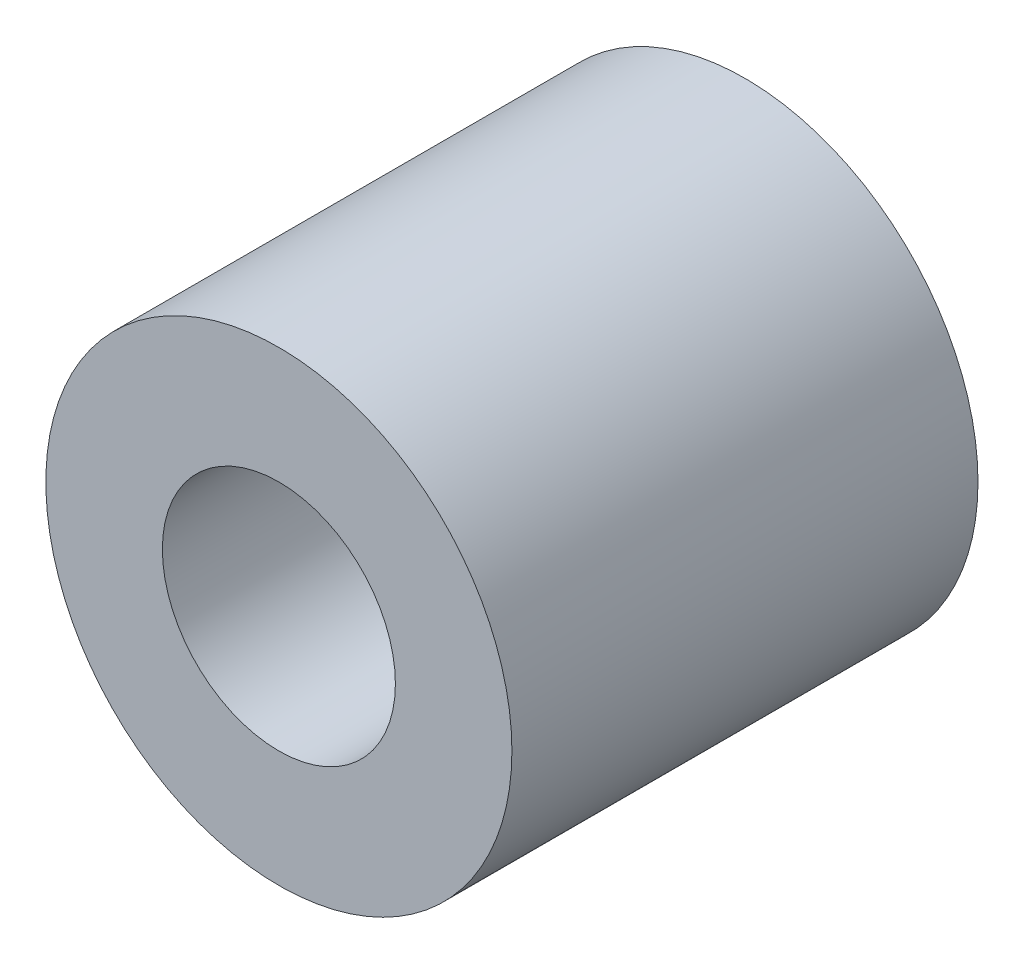
ISO-10303-21;
HEADER;
FILE_DESCRIPTION(('STEP AP214'),'2;1');
FILE_NAME('part.step','',(''),(''),'','','');
FILE_SCHEMA(('AUTOMOTIVE_DESIGN { 1 0 10303 214 1 1 1 1 }'));
ENDSEC;
DATA;
#1=APPLICATION_CONTEXT('core data for automotive mechanical design processes');
#2=APPLICATION_PROTOCOL_DEFINITION('international standard','automotive_design',2000,#1);
#3=PRODUCT_CONTEXT('',#1,'mechanical');
#4=PRODUCT('Part','Part','',(#3));
#5=PRODUCT_RELATED_PRODUCT_CATEGORY('part','',(#4));
#6=PRODUCT_DEFINITION_FORMATION('','',#4);
#7=PRODUCT_DEFINITION_CONTEXT('part definition',#1,'design');
#8=PRODUCT_DEFINITION('design','',#6,#7);
#9=PRODUCT_DEFINITION_SHAPE('','',#8);
#10=(LENGTH_UNIT() NAMED_UNIT(*) SI_UNIT(.MILLI.,.METRE.));
#11=(NAMED_UNIT(*) PLANE_ANGLE_UNIT() SI_UNIT($,.RADIAN.));
#12=(NAMED_UNIT(*) SI_UNIT($,.STERADIAN.) SOLID_ANGLE_UNIT());
#13=UNCERTAINTY_MEASURE_WITH_UNIT(LENGTH_MEASURE(1.E-05),#10,'distance_accuracy_value','');
#14=(GEOMETRIC_REPRESENTATION_CONTEXT(3) GLOBAL_UNCERTAINTY_ASSIGNED_CONTEXT((#13)) GLOBAL_UNIT_ASSIGNED_CONTEXT((#10,
#11,#12)) REPRESENTATION_CONTEXT('',''));
#15=CARTESIAN_POINT('',(0.,0.,0.));
#16=DIRECTION('',(0.,0.,1.));
#17=DIRECTION('',(1.,0.,0.));
#18=AXIS2_PLACEMENT_3D('',#15,#16,#17);
#19=CARTESIAN_POINT('',(0.,0.,20.));
#20=DIRECTION('',(0.,0.,-1.));
#21=DIRECTION('',(-1.,0.,0.));
#22=AXIS2_PLACEMENT_3D('',#19,#20,#21);
#23=CYLINDRICAL_SURFACE('',#22,10.);
#24=CARTESIAN_POINT('',(0.,0.,20.));
#25=DIRECTION('',(0.,0.,1.));
#26=DIRECTION('',(1.,0.,0.));
#27=AXIS2_PLACEMENT_3D('',#24,#25,#26);
#28=CIRCLE('',#27,10.);
#29=CARTESIAN_POINT('',(10.,0.,20.));
#30=VERTEX_POINT('',#29);
#31=EDGE_CURVE('E10',#30,#30,#28,.T.);
#32=ORIENTED_EDGE('',*,*,#31,.F.);
#33=EDGE_LOOP('',(#32));
#34=FACE_BOUND('',#33,.T.);
#35=CARTESIAN_POINT('',(0.,0.,0.));
#36=DIRECTION('',(0.,0.,1.));
#37=DIRECTION('',(1.,0.,0.));
#38=AXIS2_PLACEMENT_3D('',#35,#36,#37);
#39=CIRCLE('',#38,10.);
#40=CARTESIAN_POINT('',(10.,0.,0.));
#41=VERTEX_POINT('',#40);
#42=EDGE_CURVE('E44',#41,#41,#39,.T.);
#43=ORIENTED_EDGE('',*,*,#42,.T.);
#44=EDGE_LOOP('',(#43));
#45=FACE_BOUND('',#44,.T.);
#46=ADVANCED_FACE('F41',(#34,#45),#23,.T.);
#47=CARTESIAN_POINT('',(0.,0.,20.));
#48=DIRECTION('',(0.,0.,1.));
#49=DIRECTION('',(1.,0.,0.));
#50=AXIS2_PLACEMENT_3D('',#47,#48,#49);
#51=PLANE('',#50);
#52=CARTESIAN_POINT('',(0.,0.,20.));
#53=DIRECTION('',(0.,0.,1.));
#54=DIRECTION('',(1.,0.,0.));
#55=AXIS2_PLACEMENT_3D('',#52,#53,#54);
#56=CIRCLE('',#55,5.);
#57=CARTESIAN_POINT('',(5.,0.,20.));
#58=VERTEX_POINT('',#57);
#59=EDGE_CURVE('E53',#58,#58,#56,.T.);
#60=ORIENTED_EDGE('',*,*,#59,.F.);
#61=EDGE_LOOP('',(#60));
#62=FACE_BOUND('',#61,.T.);
#63=ORIENTED_EDGE('',*,*,#31,.T.);
#64=EDGE_LOOP('',(#63));
#65=FACE_BOUND('',#64,.T.);
#66=ADVANCED_FACE('F68',(#62,#65),#51,.T.);
#67=CARTESIAN_POINT('',(0.,0.,0.));
#68=DIRECTION('',(0.,0.,1.));
#69=DIRECTION('',(1.,0.,0.));
#70=AXIS2_PLACEMENT_3D('',#67,#68,#69);
#71=PLANE('',#70);
#72=ORIENTED_EDGE('',*,*,#42,.F.);
#73=EDGE_LOOP('',(#72));
#74=FACE_BOUND('',#73,.T.);
#75=ADVANCED_FACE('F64',(#74),#71,.F.);
#76=CARTESIAN_POINT('',(0.,0.,10.));
#77=DIRECTION('',(0.,0.,1.));
#78=DIRECTION('',(1.,0.,0.));
#79=AXIS2_PLACEMENT_3D('',#76,#77,#78);
#80=CYLINDRICAL_SURFACE('',#79,5.);
#81=CARTESIAN_POINT('',(0.,0.,10.));
#82=DIRECTION('',(0.,0.,1.));
#83=DIRECTION('',(1.,0.,0.));
#84=AXIS2_PLACEMENT_3D('',#81,#82,#83);
#85=CIRCLE('',#84,5.);
#86=CARTESIAN_POINT('',(5.,0.,10.));
#87=VERTEX_POINT('',#86);
#88=EDGE_CURVE('E51',#87,#87,#85,.T.);
#89=ORIENTED_EDGE('',*,*,#88,.F.);
#90=EDGE_LOOP('',(#89));
#91=FACE_BOUND('',#90,.T.);
#92=ORIENTED_EDGE('',*,*,#59,.T.);
#93=EDGE_LOOP('',(#92));
#94=FACE_BOUND('',#93,.T.);
#95=ADVANCED_FACE('F61',(#91,#94),#80,.F.);
#96=CARTESIAN_POINT('',(0.,0.,10.));
#97=DIRECTION('',(0.,0.,1.));
#98=DIRECTION('',(1.,0.,0.));
#99=AXIS2_PLACEMENT_3D('',#96,#97,#98);
#100=PLANE('',#99);
#101=ORIENTED_EDGE('',*,*,#88,.T.);
#102=EDGE_LOOP('',(#101));
#103=FACE_BOUND('',#102,.T.);
#104=ADVANCED_FACE('F59',(#103),#100,.T.);
#105=CLOSED_SHELL('',(#46,#66,#75,#95,#104));
#106=MANIFOLD_SOLID_BREP('B2',#105);
#107=ADVANCED_BREP_SHAPE_REPRESENTATION('',(#18,#106),#14);
#108=SHAPE_DEFINITION_REPRESENTATION(#9,#107);
ENDSEC;
END-ISO-10303-21;
